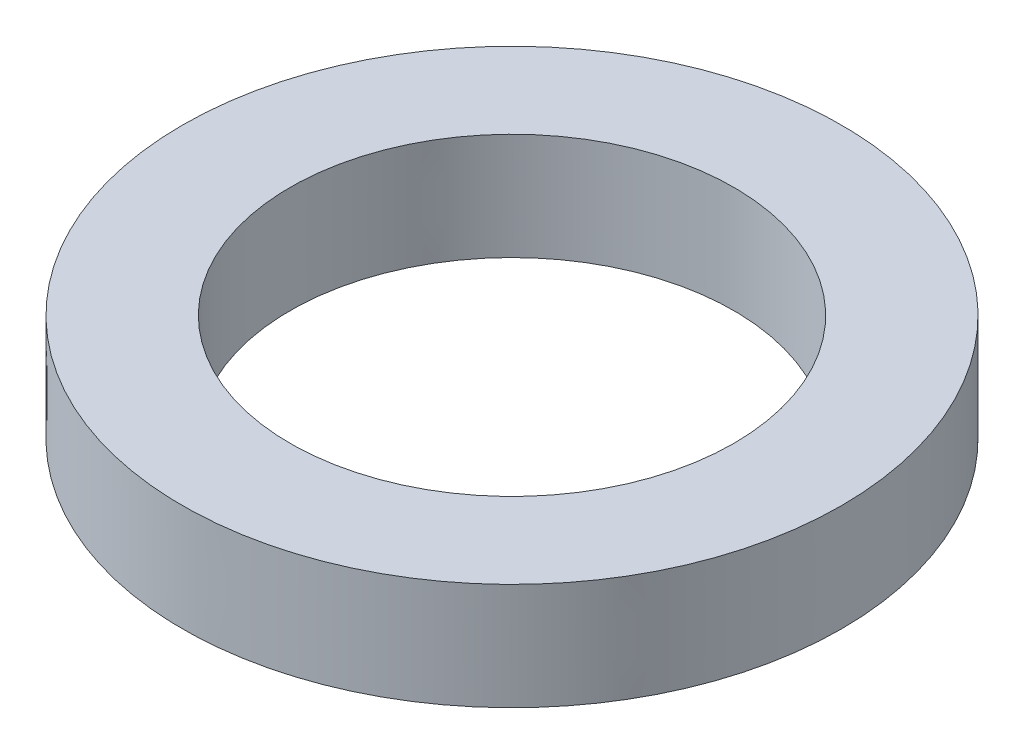
ISO-10303-21;
HEADER;
FILE_DESCRIPTION(('STEP AP214'),'2;1');
FILE_NAME('part.step','',(''),(''),'','','');
FILE_SCHEMA(('AUTOMOTIVE_DESIGN { 1 0 10303 214 1 1 1 1 }'));
ENDSEC;
DATA;
#1=APPLICATION_CONTEXT('core data for automotive mechanical design processes');
#2=APPLICATION_PROTOCOL_DEFINITION('international standard','automotive_design',2000,#1);
#3=PRODUCT_CONTEXT('',#1,'mechanical');
#4=PRODUCT('Part','Part','',(#3));
#5=PRODUCT_RELATED_PRODUCT_CATEGORY('part','',(#4));
#6=PRODUCT_DEFINITION_FORMATION('','',#4);
#7=PRODUCT_DEFINITION_CONTEXT('part definition',#1,'design');
#8=PRODUCT_DEFINITION('design','',#6,#7);
#9=PRODUCT_DEFINITION_SHAPE('','',#8);
#10=(LENGTH_UNIT() NAMED_UNIT(*) SI_UNIT(.MILLI.,.METRE.));
#11=(NAMED_UNIT(*) PLANE_ANGLE_UNIT() SI_UNIT($,.RADIAN.));
#12=(NAMED_UNIT(*) SI_UNIT($,.STERADIAN.) SOLID_ANGLE_UNIT());
#13=UNCERTAINTY_MEASURE_WITH_UNIT(LENGTH_MEASURE(1.E-05),#10,'distance_accuracy_value','');
#14=(GEOMETRIC_REPRESENTATION_CONTEXT(3) GLOBAL_UNCERTAINTY_ASSIGNED_CONTEXT((#13)) GLOBAL_UNIT_ASSIGNED_CONTEXT((#10,
#11,#12)) REPRESENTATION_CONTEXT('',''));
#15=CARTESIAN_POINT('',(0.,0.,0.));
#16=DIRECTION('',(0.,0.,1.));
#17=DIRECTION('',(1.,0.,0.));
#18=AXIS2_PLACEMENT_3D('',#15,#16,#17);
#19=CARTESIAN_POINT('',(9.30644934123419E-09,0.000190361392920514,0.));
#20=DIRECTION('',(4.88883233482044E-05,0.999999998804966,0.));
#21=DIRECTION('',(-0.999999998804966,4.88883233482044E-05,0.));
#22=AXIS2_PLACEMENT_3D('',#19,#20,#21);
#23=CONICAL_SURFACE('',#22,13.6913312113366,1.57074743847153);
#24=CARTESIAN_POINT('',(1.13738558563609E-08,0.000232649742593116,0.));
#25=DIRECTION('',(-4.88883233482044E-05,-0.999999998804966,0.));
#26=DIRECTION('',(0.999999998804966,-4.88883233482044E-05,0.));
#27=AXIS2_PLACEMENT_3D('',#24,#25,#26);
#28=CIRCLE('',#27,14.5563301881131);
#29=CARTESIAN_POINT('',(14.5563301820917,-0.000478984834406588,0.));
#30=VERTEX_POINT('',#29);
#31=EDGE_CURVE('E10',#30,#30,#28,.T.);
#32=ORIENTED_EDGE('',*,*,#31,.T.);
#33=EDGE_LOOP('',(#32));
#34=FACE_BOUND('',#33,.T.);
#35=CARTESIAN_POINT('',(9.30644934123419E-09,0.000190361392920514,0.));
#36=DIRECTION('',(-4.88883233482044E-05,-0.999999998804966,0.));
#37=DIRECTION('',(0.999999998804966,-4.88883233482044E-05,0.));
#38=AXIS2_PLACEMENT_3D('',#35,#36,#37);
#39=CIRCLE('',#38,13.6913312113366);
#40=CARTESIAN_POINT('',(13.6913312042814,-0.000478984834406671,0.));
#41=VERTEX_POINT('',#40);
#42=EDGE_CURVE('E58',#41,#41,#39,.T.);
#43=ORIENTED_EDGE('',*,*,#42,.F.);
#44=EDGE_LOOP('',(#43));
#45=FACE_BOUND('',#44,.T.);
#46=ADVANCED_FACE('F30',(#34,#45),#23,.T.);
#47=CARTESIAN_POINT('',(1.13738558563609E-08,0.000232649742593116,0.));
#48=DIRECTION('',(-4.88883233482044E-05,-0.999999998804966,0.));
#49=DIRECTION('',(0.999999998804966,-4.88883233482044E-05,0.));
#50=AXIS2_PLACEMENT_3D('',#47,#48,#49);
#51=CONICAL_SURFACE('',#50,14.5563301881131,4.88883233672891E-05);
#52=CARTESIAN_POINT('',(0.000230640036620748,4.71769168073947,0.));
#53=DIRECTION('',(-4.88883233482044E-05,-0.999999998804966,0.));
#54=DIRECTION('',(0.999999998804966,-4.88883233482044E-05,0.));
#55=AXIS2_PLACEMENT_3D('',#52,#53,#54);
#56=CIRCLE('',#55,14.5560995594501);
#57=CARTESIAN_POINT('',(14.5563301820917,4.71698005743752,0.));
#58=VERTEX_POINT('',#57);
#59=EDGE_CURVE('E36',#58,#58,#56,.T.);
#60=ORIENTED_EDGE('',*,*,#59,.T.);
#61=EDGE_LOOP('',(#60));
#62=FACE_BOUND('',#61,.T.);
#63=ORIENTED_EDGE('',*,*,#31,.F.);
#64=EDGE_LOOP('',(#63));
#65=FACE_BOUND('',#64,.T.);
#66=ADVANCED_FACE('F66',(#62,#65),#51,.T.);
#67=CARTESIAN_POINT('',(0.000230640036620748,4.71769168073947,0.));
#68=DIRECTION('',(4.88883233482044E-05,0.999999998804966,0.));
#69=DIRECTION('',(-0.999999998804966,4.88883233482044E-05,0.));
#70=AXIS2_PLACEMENT_3D('',#67,#68,#69);
#71=CONICAL_SURFACE('',#70,14.5560995594501,1.57074743847153);
#72=CARTESIAN_POINT('',(0.000230628662764892,4.71745903099688,0.));
#73=DIRECTION('',(-4.88883233482044E-05,-0.999999998804966,0.));
#74=DIRECTION('',(0.999999998804966,-4.88883233482044E-05,0.));
#75=AXIS2_PLACEMENT_3D('',#72,#73,#74);
#76=CIRCLE('',#75,9.79729977545409);
#77=CARTESIAN_POINT('',(9.79753039240874,4.71698005743752,0.));
#78=VERTEX_POINT('',#77);
#79=EDGE_CURVE('E40',#78,#78,#76,.T.);
#80=ORIENTED_EDGE('',*,*,#79,.T.);
#81=EDGE_LOOP('',(#80));
#82=FACE_BOUND('',#81,.T.);
#83=ORIENTED_EDGE('',*,*,#59,.F.);
#84=EDGE_LOOP('',(#83));
#85=FACE_BOUND('',#84,.T.);
#86=ADVANCED_FACE('F70',(#82,#85),#71,.F.);
#87=CARTESIAN_POINT('',(0.000230628662764892,4.71745903099688,0.));
#88=DIRECTION('',(-4.88883233482044E-05,-0.999999998804966,0.));
#89=DIRECTION('',(0.999999998804966,-4.88883233482044E-05,0.));
#90=AXIS2_PLACEMENT_3D('',#87,#88,#89);
#91=CONICAL_SURFACE('',#90,9.79729977545409,4.88883233672891E-05);
#92=CARTESIAN_POINT('',(0.,0.,0.));
#93=DIRECTION('',(-4.88883233482044E-05,-0.999999998804966,0.));
#94=DIRECTION('',(0.999999998804966,-4.88883233482044E-05,0.));
#95=AXIS2_PLACEMENT_3D('',#92,#93,#94);
#96=CIRCLE('',#95,9.79753040411713);
#97=CARTESIAN_POINT('',(9.79753039240874,-0.000478984834406671,0.));
#98=VERTEX_POINT('',#97);
#99=EDGE_CURVE('E44',#98,#98,#96,.T.);
#100=ORIENTED_EDGE('',*,*,#99,.T.);
#101=EDGE_LOOP('',(#100));
#102=FACE_BOUND('',#101,.T.);
#103=ORIENTED_EDGE('',*,*,#79,.F.);
#104=EDGE_LOOP('',(#103));
#105=FACE_BOUND('',#104,.T.);
#106=ADVANCED_FACE('F74',(#102,#105),#91,.F.);
#107=CARTESIAN_POINT('',(0.,0.,0.));
#108=DIRECTION('',(4.88883233482044E-05,0.999999998804966,0.));
#109=DIRECTION('',(-0.999999998804966,4.88883233482044E-05,0.));
#110=AXIS2_PLACEMENT_3D('',#107,#108,#109);
#111=CONICAL_SURFACE('',#110,9.79753040411713,1.57074743847152);
#112=CARTESIAN_POINT('',(3.66940680490418E-09,7.50569164416617E-05,0.));
#113=DIRECTION('',(-4.88883233482044E-05,-0.999999998804966,0.));
#114=DIRECTION('',(0.999999998804966,-4.88883233482044E-05,0.));
#115=AXIS2_PLACEMENT_3D('',#112,#113,#114);
#116=CIRCLE('',#115,11.3328032726408);
#117=CARTESIAN_POINT('',(11.3328032627672,-0.000478984834392793,0.));
#118=VERTEX_POINT('',#117);
#119=EDGE_CURVE('E49',#118,#118,#116,.T.);
#120=ORIENTED_EDGE('',*,*,#119,.T.);
#121=EDGE_LOOP('',(#120));
#122=FACE_BOUND('',#121,.T.);
#123=ORIENTED_EDGE('',*,*,#99,.F.);
#124=EDGE_LOOP('',(#123));
#125=FACE_BOUND('',#124,.T.);
#126=ADVANCED_FACE('F81',(#122,#125),#111,.T.);
#127=CARTESIAN_POINT('',(3.66940680490418E-09,7.50569164416617E-05,0.));
#128=DIRECTION('',(4.88883233482044E-05,0.999999998804966,0.));
#129=DIRECTION('',(-0.999999998804966,4.88883233482044E-05,0.));
#130=AXIS2_PLACEMENT_3D('',#127,#128,#129);
#131=CONICAL_SURFACE('',#130,11.3328032726408,0.240460944795582);
#132=CARTESIAN_POINT('',(0.000136031874992245,2.78250235461754,0.));
#133=DIRECTION('',(-4.88883233482044E-05,-0.999999998804966,0.));
#134=DIRECTION('',(0.999999998804966,-4.88883233482044E-05,0.));
#135=AXIS2_PLACEMENT_3D('',#132,#133,#134);
#136=CIRCLE('',#135,12.0150692129761);
#137=CARTESIAN_POINT('',(12.0152052304927,2.78191495802881,0.));
#138=VERTEX_POINT('',#137);
#139=EDGE_CURVE('E52',#138,#138,#136,.T.);
#140=ORIENTED_EDGE('',*,*,#139,.T.);
#141=EDGE_LOOP('',(#140));
#142=FACE_BOUND('',#141,.T.);
#143=ORIENTED_EDGE('',*,*,#119,.F.);
#144=EDGE_LOOP('',(#143));
#145=FACE_BOUND('',#144,.T.);
#146=ADVANCED_FACE('F85',(#142,#145),#131,.T.);
#147=CARTESIAN_POINT('',(0.000136031874992245,2.78250235461754,0.));
#148=DIRECTION('',(4.88883233482044E-05,0.999999998804966,0.));
#149=DIRECTION('',(-0.999999998804966,4.88883233482044E-05,0.));
#150=AXIS2_PLACEMENT_3D('',#147,#148,#149);
#151=CONICAL_SURFACE('',#150,12.0150692129761,1.51622892144814);
#152=CARTESIAN_POINT('',(0.000137409186639038,2.81067496416558,0.));
#153=DIRECTION('',(-4.88883233482044E-05,-0.999999998804966,0.));
#154=DIRECTION('',(0.999999998804966,-4.88883233482044E-05,0.));
#155=AXIS2_PLACEMENT_3D('',#152,#153,#154);
#156=CIRCLE('',#155,12.5308467468404);
#157=CARTESIAN_POINT('',(12.5309841410522,2.81006235207799,0.));
#158=VERTEX_POINT('',#157);
#159=EDGE_CURVE('E55',#158,#158,#156,.T.);
#160=ORIENTED_EDGE('',*,*,#159,.T.);
#161=EDGE_LOOP('',(#160));
#162=FACE_BOUND('',#161,.T.);
#163=ORIENTED_EDGE('',*,*,#139,.F.);
#164=EDGE_LOOP('',(#163));
#165=FACE_BOUND('',#164,.T.);
#166=ADVANCED_FACE('F89',(#162,#165),#151,.T.);
#167=CARTESIAN_POINT('',(0.000137409186639038,2.81067496416558,0.));
#168=DIRECTION('',(-4.88883233482044E-05,-0.999999998804966,0.));
#169=DIRECTION('',(0.999999998804966,-4.88883233482044E-05,0.));
#170=AXIS2_PLACEMENT_3D('',#167,#168,#169);
#171=CONICAL_SURFACE('',#170,12.5308467468404,0.391588117708526);
#172=ORIENTED_EDGE('',*,*,#42,.T.);
#173=EDGE_LOOP('',(#172));
#174=FACE_BOUND('',#173,.T.);
#175=ORIENTED_EDGE('',*,*,#159,.F.);
#176=EDGE_LOOP('',(#175));
#177=FACE_BOUND('',#176,.T.);
#178=ADVANCED_FACE('F62',(#174,#177),#171,.F.);
#179=CLOSED_SHELL('',(#46,#66,#86,#106,#126,#146,#166,#178));
#180=MANIFOLD_SOLID_BREP('B2',#179);
#181=ADVANCED_BREP_SHAPE_REPRESENTATION('',(#18,#180),#14);
#182=SHAPE_DEFINITION_REPRESENTATION(#9,#181);
ENDSEC;
END-ISO-10303-21;
